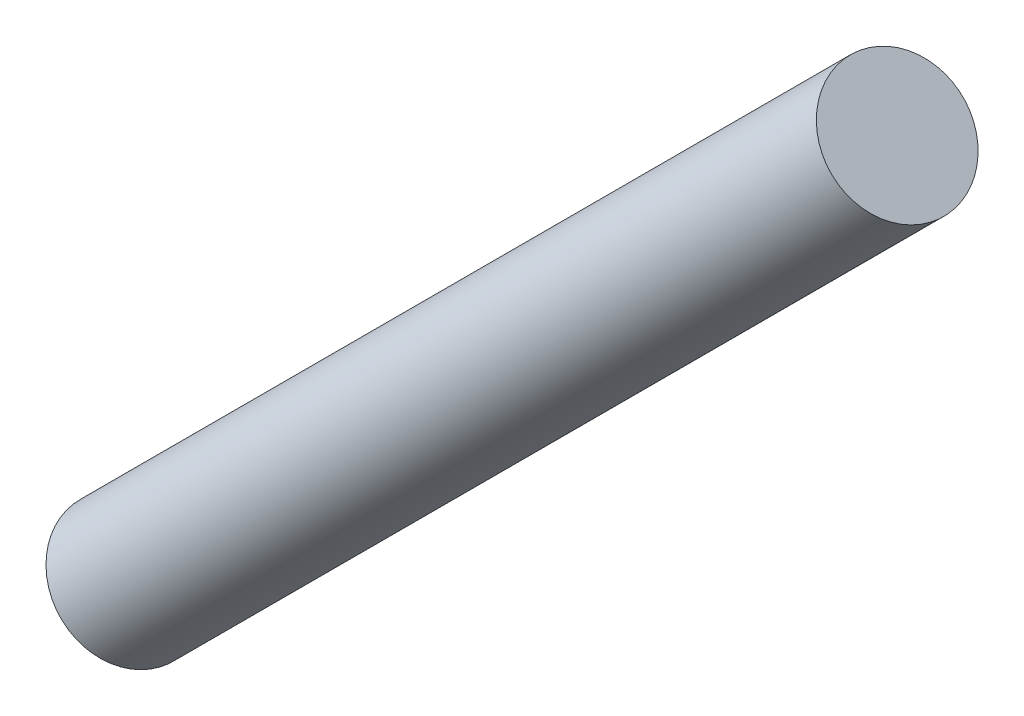
ISO-10303-21;
HEADER;
FILE_DESCRIPTION(('STEP AP214'),'2;1');
FILE_NAME('part.step','',(''),(''),'','','');
FILE_SCHEMA(('AUTOMOTIVE_DESIGN { 1 0 10303 214 1 1 1 1 }'));
ENDSEC;
DATA;
#1=APPLICATION_CONTEXT('core data for automotive mechanical design processes');
#2=APPLICATION_PROTOCOL_DEFINITION('international standard','automotive_design',2000,#1);
#3=PRODUCT_CONTEXT('',#1,'mechanical');
#4=PRODUCT('Part','Part','',(#3));
#5=PRODUCT_RELATED_PRODUCT_CATEGORY('part','',(#4));
#6=PRODUCT_DEFINITION_FORMATION('','',#4);
#7=PRODUCT_DEFINITION_CONTEXT('part definition',#1,'design');
#8=PRODUCT_DEFINITION('design','',#6,#7);
#9=PRODUCT_DEFINITION_SHAPE('','',#8);
#10=(LENGTH_UNIT() NAMED_UNIT(*) SI_UNIT(.MILLI.,.METRE.));
#11=(NAMED_UNIT(*) PLANE_ANGLE_UNIT() SI_UNIT($,.RADIAN.));
#12=(NAMED_UNIT(*) SI_UNIT($,.STERADIAN.) SOLID_ANGLE_UNIT());
#13=UNCERTAINTY_MEASURE_WITH_UNIT(LENGTH_MEASURE(1.E-05),#10,'distance_accuracy_value','');
#14=(GEOMETRIC_REPRESENTATION_CONTEXT(3) GLOBAL_UNCERTAINTY_ASSIGNED_CONTEXT((#13)) GLOBAL_UNIT_ASSIGNED_CONTEXT((#10,
#11,#12)) REPRESENTATION_CONTEXT('',''));
#15=CARTESIAN_POINT('',(0.,0.,0.));
#16=DIRECTION('',(0.,0.,1.));
#17=DIRECTION('',(1.,0.,0.));
#18=AXIS2_PLACEMENT_3D('',#15,#16,#17);
#19=CARTESIAN_POINT('',(50.,0.,0.));
#20=DIRECTION('',(0.707106781186548,0.707106781186548,0.));
#21=DIRECTION('',(0.,0.,-1.));
#22=AXIS2_PLACEMENT_3D('',#19,#20,#21);
#23=PLANE('',#22);
#24=CARTESIAN_POINT('',(50.,0.,0.));
#25=DIRECTION('',(0.707106781186548,0.707106781186548,0.));
#26=DIRECTION('',(0.49999999999984,-0.49999999999984,-0.707106781186774));
#27=AXIS2_PLACEMENT_3D('',#24,#25,#26);
#28=CIRCLE('',#27,15.);
#29=CARTESIAN_POINT('',(57.5,-7.5,-10.60660171779));
#30=VERTEX_POINT('',#29);
#31=EDGE_CURVE('E9',#30,#30,#28,.T.);
#32=ORIENTED_EDGE('',*,*,#31,.F.);
#33=EDGE_LOOP('',(#32));
#34=FACE_BOUND('',#33,.T.);
#35=ADVANCED_FACE('F15',(#34),#23,.F.);
#36=CARTESIAN_POINT('',(225.,175.,0.));
#37=DIRECTION('',(0.707106781186548,0.707106781186548,0.));
#38=DIRECTION('',(0.,0.,-1.));
#39=AXIS2_PLACEMENT_3D('',#36,#37,#38);
#40=PLANE('',#39);
#41=CARTESIAN_POINT('',(225.,175.,0.));
#42=DIRECTION('',(0.707106781186548,0.707106781186548,0.));
#43=DIRECTION('',(0.49999999999984,-0.49999999999984,-0.707106781186774));
#44=AXIS2_PLACEMENT_3D('',#41,#42,#43);
#45=CIRCLE('',#44,15.);
#46=CARTESIAN_POINT('',(232.5,167.5,-10.60660171779));
#47=VERTEX_POINT('',#46);
#48=EDGE_CURVE('E39',#47,#47,#45,.T.);
#49=ORIENTED_EDGE('',*,*,#48,.T.);
#50=EDGE_LOOP('',(#49));
#51=FACE_BOUND('',#50,.T.);
#52=ADVANCED_FACE('F42',(#51),#40,.T.);
#53=CARTESIAN_POINT('',(50.,0.,0.));
#54=DIRECTION('',(0.707106781186548,0.707106781186548,0.));
#55=DIRECTION('',(0.49999999999984,-0.49999999999984,-0.707106781186774));
#56=AXIS2_PLACEMENT_3D('',#53,#54,#55);
#57=CYLINDRICAL_SURFACE('',#56,15.);
#58=ORIENTED_EDGE('',*,*,#48,.F.);
#59=DIRECTION('',(0.707106781186548,0.707106781186548,0.));
#60=VECTOR('',#59,1.);
#61=CARTESIAN_POINT('',(57.5,-7.5,-10.60660171779));
#62=LINE('',#61,#60);
#63=EDGE_CURVE('E23',#30,#47,#62,.T.);
#64=ORIENTED_EDGE('',*,*,#63,.F.);
#65=ORIENTED_EDGE('',*,*,#31,.T.);
#66=ORIENTED_EDGE('',*,*,#63,.T.);
#67=EDGE_LOOP('',(#58,#64,#65,#66));
#68=FACE_BOUND('',#67,.T.);
#69=ADVANCED_FACE('F38',(#68),#57,.T.);
#70=CLOSED_SHELL('',(#35,#52,#69));
#71=MANIFOLD_SOLID_BREP('B1',#70);
#72=ADVANCED_BREP_SHAPE_REPRESENTATION('',(#18,#71),#14);
#73=SHAPE_DEFINITION_REPRESENTATION(#9,#72);
ENDSEC;
END-ISO-10303-21;
